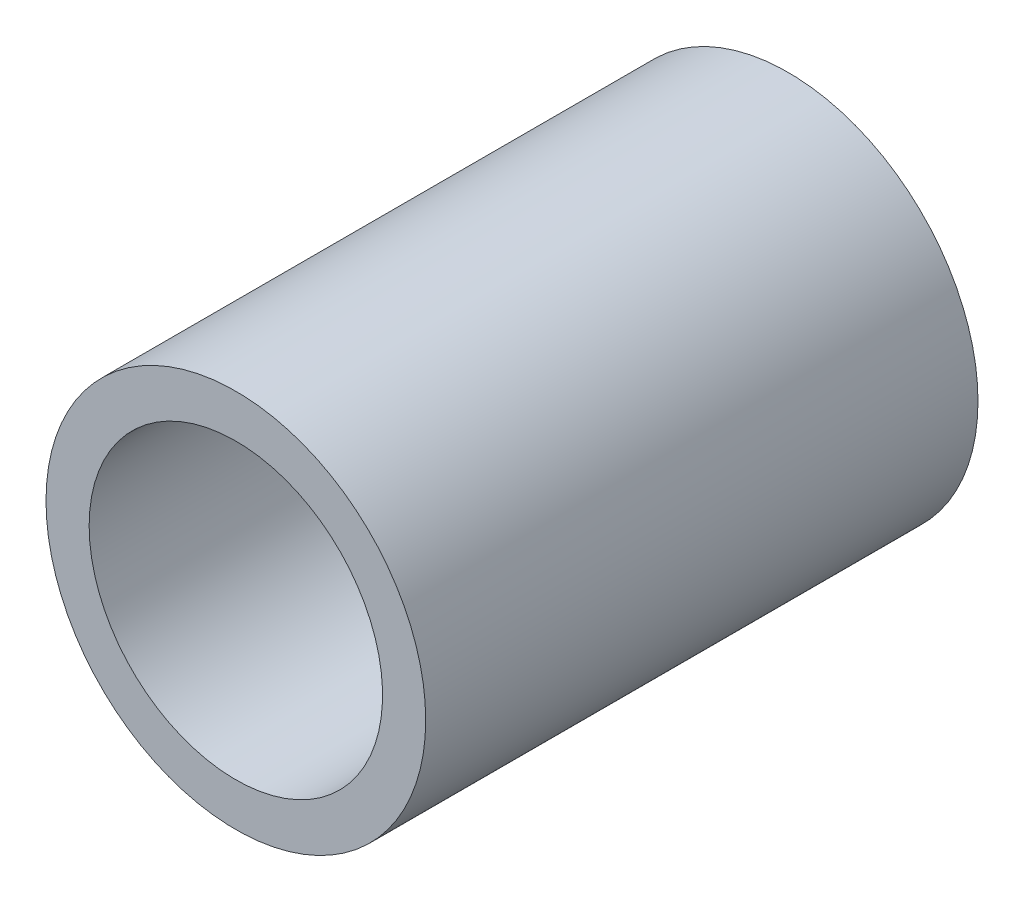
ISO-10303-21;
HEADER;
FILE_DESCRIPTION(('STEP AP214'),'2;1');
FILE_NAME('part.step','',(''),(''),'','','');
FILE_SCHEMA(('AUTOMOTIVE_DESIGN { 1 0 10303 214 1 1 1 1 }'));
ENDSEC;
DATA;
#1=APPLICATION_CONTEXT('core data for automotive mechanical design processes');
#2=APPLICATION_PROTOCOL_DEFINITION('international standard','automotive_design',2000,#1);
#3=PRODUCT_CONTEXT('',#1,'mechanical');
#4=PRODUCT('Part','Part','',(#3));
#5=PRODUCT_RELATED_PRODUCT_CATEGORY('part','',(#4));
#6=PRODUCT_DEFINITION_FORMATION('','',#4);
#7=PRODUCT_DEFINITION_CONTEXT('part definition',#1,'design');
#8=PRODUCT_DEFINITION('design','',#6,#7);
#9=PRODUCT_DEFINITION_SHAPE('','',#8);
#10=(LENGTH_UNIT() NAMED_UNIT(*) SI_UNIT(.MILLI.,.METRE.));
#11=(NAMED_UNIT(*) PLANE_ANGLE_UNIT() SI_UNIT($,.RADIAN.));
#12=(NAMED_UNIT(*) SI_UNIT($,.STERADIAN.) SOLID_ANGLE_UNIT());
#13=UNCERTAINTY_MEASURE_WITH_UNIT(LENGTH_MEASURE(1.E-05),#10,'distance_accuracy_value','');
#14=(GEOMETRIC_REPRESENTATION_CONTEXT(3) GLOBAL_UNCERTAINTY_ASSIGNED_CONTEXT((#13)) GLOBAL_UNIT_ASSIGNED_CONTEXT((#10,
#11,#12)) REPRESENTATION_CONTEXT('',''));
#15=CARTESIAN_POINT('',(0.,0.,0.));
#16=DIRECTION('',(0.,0.,1.));
#17=DIRECTION('',(1.,0.,0.));
#18=AXIS2_PLACEMENT_3D('',#15,#16,#17);
#19=CARTESIAN_POINT('',(0.,0.,16.));
#20=DIRECTION('',(0.,0.,-1.));
#21=DIRECTION('',(-1.,0.,0.));
#22=AXIS2_PLACEMENT_3D('',#19,#20,#21);
#23=CYLINDRICAL_SURFACE('',#22,4.25);
#24=CARTESIAN_POINT('',(0.,0.,0.));
#25=DIRECTION('',(0.,0.,-1.));
#26=DIRECTION('',(-1.,0.,0.));
#27=AXIS2_PLACEMENT_3D('',#24,#25,#26);
#28=CIRCLE('',#27,4.25);
#29=CARTESIAN_POINT('',(-4.25,0.,0.));
#30=VERTEX_POINT('',#29);
#31=EDGE_CURVE('E18',#30,#30,#28,.T.);
#32=ORIENTED_EDGE('',*,*,#31,.T.);
#33=EDGE_LOOP('',(#32));
#34=FACE_BOUND('',#33,.T.);
#35=CARTESIAN_POINT('',(0.,0.,16.));
#36=DIRECTION('',(0.,0.,-1.));
#37=DIRECTION('',(-1.,0.,0.));
#38=AXIS2_PLACEMENT_3D('',#35,#36,#37);
#39=CIRCLE('',#38,4.25);
#40=CARTESIAN_POINT('',(-4.25,0.,16.));
#41=VERTEX_POINT('',#40);
#42=EDGE_CURVE('E27',#41,#41,#39,.T.);
#43=ORIENTED_EDGE('',*,*,#42,.F.);
#44=EDGE_LOOP('',(#43));
#45=FACE_BOUND('',#44,.T.);
#46=ADVANCED_FACE('F15',(#34,#45),#23,.F.);
#47=CARTESIAN_POINT('',(0.,0.,0.));
#48=DIRECTION('',(0.,0.,1.));
#49=DIRECTION('',(1.,0.,0.));
#50=AXIS2_PLACEMENT_3D('',#47,#48,#49);
#51=PLANE('',#50);
#52=ORIENTED_EDGE('',*,*,#31,.F.);
#53=EDGE_LOOP('',(#52));
#54=FACE_BOUND('',#53,.T.);
#55=CARTESIAN_POINT('',(0.,0.,0.));
#56=DIRECTION('',(0.,0.,-1.));
#57=DIRECTION('',(-1.,0.,0.));
#58=AXIS2_PLACEMENT_3D('',#55,#56,#57);
#59=CIRCLE('',#58,5.5);
#60=CARTESIAN_POINT('',(-5.5,0.,0.));
#61=VERTEX_POINT('',#60);
#62=EDGE_CURVE('E22',#61,#61,#59,.F.);
#63=ORIENTED_EDGE('',*,*,#62,.F.);
#64=EDGE_LOOP('',(#63));
#65=FACE_BOUND('',#64,.T.);
#66=ADVANCED_FACE('F37',(#54,#65),#51,.F.);
#67=CARTESIAN_POINT('',(0.,0.,16.));
#68=DIRECTION('',(0.,0.,1.));
#69=DIRECTION('',(1.,0.,0.));
#70=AXIS2_PLACEMENT_3D('',#67,#68,#69);
#71=PLANE('',#70);
#72=ORIENTED_EDGE('',*,*,#42,.T.);
#73=EDGE_LOOP('',(#72));
#74=FACE_BOUND('',#73,.T.);
#75=CARTESIAN_POINT('',(0.,0.,16.));
#76=DIRECTION('',(0.,0.,-1.));
#77=DIRECTION('',(-1.,0.,0.));
#78=AXIS2_PLACEMENT_3D('',#75,#76,#77);
#79=CIRCLE('',#78,5.5);
#80=CARTESIAN_POINT('',(-5.5,0.,16.));
#81=VERTEX_POINT('',#80);
#82=EDGE_CURVE('E10',#81,#81,#79,.T.);
#83=ORIENTED_EDGE('',*,*,#82,.F.);
#84=EDGE_LOOP('',(#83));
#85=FACE_BOUND('',#84,.T.);
#86=ADVANCED_FACE('F40',(#74,#85),#71,.T.);
#87=CARTESIAN_POINT('',(0.,0.,16.));
#88=DIRECTION('',(0.,0.,-1.));
#89=DIRECTION('',(-1.,0.,0.));
#90=AXIS2_PLACEMENT_3D('',#87,#88,#89);
#91=CYLINDRICAL_SURFACE('',#90,5.5);
#92=ORIENTED_EDGE('',*,*,#82,.T.);
#93=EDGE_LOOP('',(#92));
#94=FACE_BOUND('',#93,.T.);
#95=ORIENTED_EDGE('',*,*,#62,.T.);
#96=EDGE_LOOP('',(#95));
#97=FACE_BOUND('',#96,.T.);
#98=ADVANCED_FACE('F43',(#94,#97),#91,.T.);
#99=CLOSED_SHELL('',(#46,#66,#86,#98));
#100=MANIFOLD_SOLID_BREP('B1',#99);
#101=ADVANCED_BREP_SHAPE_REPRESENTATION('',(#18,#100),#14);
#102=SHAPE_DEFINITION_REPRESENTATION(#9,#101);
ENDSEC;
END-ISO-10303-21;
